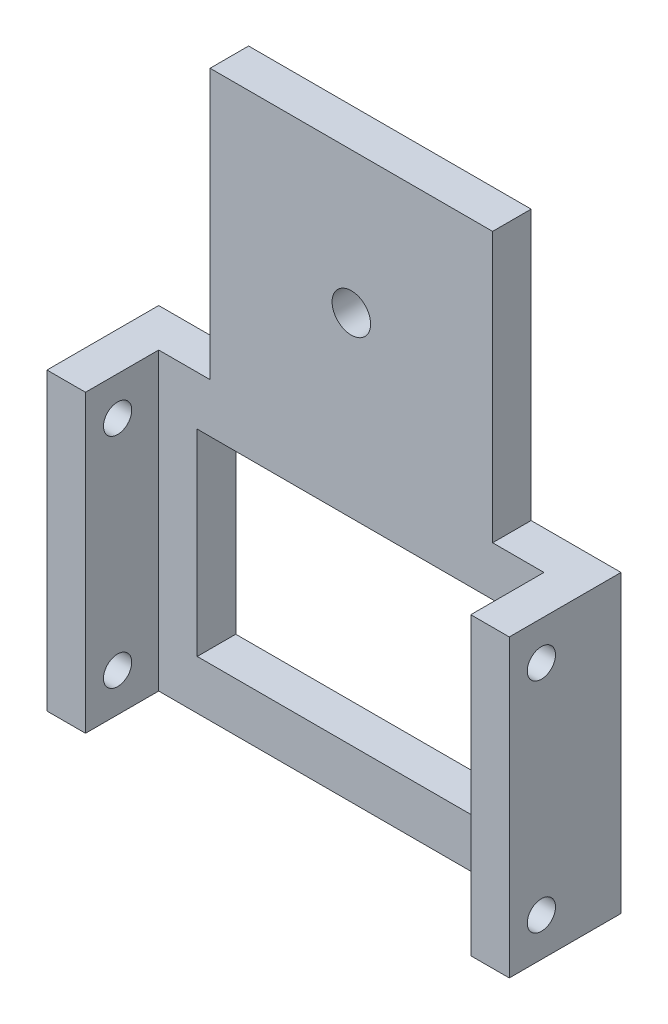
ISO-10303-21;
HEADER;
FILE_DESCRIPTION(('STEP AP214'),'2;1');
FILE_NAME('part.step','',(''),(''),'','','');
FILE_SCHEMA(('AUTOMOTIVE_DESIGN { 1 0 10303 214 1 1 1 1 }'));
ENDSEC;
DATA;
#1=APPLICATION_CONTEXT('core data for automotive mechanical design processes');
#2=APPLICATION_PROTOCOL_DEFINITION('international standard','automotive_design',2000,#1);
#3=PRODUCT_CONTEXT('',#1,'mechanical');
#4=PRODUCT('Part','Part','',(#3));
#5=PRODUCT_RELATED_PRODUCT_CATEGORY('part','',(#4));
#6=PRODUCT_DEFINITION_FORMATION('','',#4);
#7=PRODUCT_DEFINITION_CONTEXT('part definition',#1,'design');
#8=PRODUCT_DEFINITION('design','',#6,#7);
#9=PRODUCT_DEFINITION_SHAPE('','',#8);
#10=(LENGTH_UNIT() NAMED_UNIT(*) SI_UNIT(.MILLI.,.METRE.));
#11=(NAMED_UNIT(*) PLANE_ANGLE_UNIT() SI_UNIT($,.RADIAN.));
#12=(NAMED_UNIT(*) SI_UNIT($,.STERADIAN.) SOLID_ANGLE_UNIT());
#13=UNCERTAINTY_MEASURE_WITH_UNIT(LENGTH_MEASURE(1.E-05),#10,'distance_accuracy_value','');
#14=(GEOMETRIC_REPRESENTATION_CONTEXT(3) GLOBAL_UNCERTAINTY_ASSIGNED_CONTEXT((#13)) GLOBAL_UNIT_ASSIGNED_CONTEXT((#10,
#11,#12)) REPRESENTATION_CONTEXT('',''));
#15=CARTESIAN_POINT('',(0.,0.,0.));
#16=DIRECTION('',(0.,0.,1.));
#17=DIRECTION('',(1.,0.,0.));
#18=AXIS2_PLACEMENT_3D('',#15,#16,#17);
#19=CARTESIAN_POINT('',(0.,7.66666666666664,3.));
#20=DIRECTION('',(0.,1.,0.));
#21=DIRECTION('',(0.,0.,1.));
#22=AXIS2_PLACEMENT_3D('',#19,#20,#21);
#23=PLANE('',#22);
#24=DIRECTION('',(1.,0.,0.));
#25=VECTOR('',#24,1.);
#26=CARTESIAN_POINT('',(0.,7.66666666666664,0.));
#27=LINE('',#26,#25);
#28=CARTESIAN_POINT('',(-12.,7.66666666666664,0.));
#29=VERTEX_POINT('',#28);
#30=CARTESIAN_POINT('',(12.,7.66666666666664,0.));
#31=VERTEX_POINT('',#30);
#32=EDGE_CURVE('E181',#29,#31,#27,.T.);
#33=ORIENTED_EDGE('',*,*,#32,.T.);
#34=DIRECTION('',(0.,0.,-1.));
#35=VECTOR('',#34,1.);
#36=CARTESIAN_POINT('',(12.,7.66666666666664,3.));
#37=LINE('',#36,#35);
#38=CARTESIAN_POINT('',(12.,7.66666666666664,3.));
#39=VERTEX_POINT('',#38);
#40=EDGE_CURVE('E11',#39,#31,#37,.T.);
#41=ORIENTED_EDGE('',*,*,#40,.F.);
#42=DIRECTION('',(1.,0.,0.));
#43=VECTOR('',#42,1.);
#44=CARTESIAN_POINT('',(0.,7.66666666666664,3.));
#45=LINE('',#44,#43);
#46=CARTESIAN_POINT('',(-12.,7.66666666666664,3.));
#47=VERTEX_POINT('',#46);
#48=EDGE_CURVE('E131',#47,#39,#45,.T.);
#49=ORIENTED_EDGE('',*,*,#48,.F.);
#50=DIRECTION('',(0.,0.,-1.));
#51=VECTOR('',#50,1.);
#52=CARTESIAN_POINT('',(-12.,7.66666666666664,3.));
#53=LINE('',#52,#51);
#54=EDGE_CURVE('E61',#47,#29,#53,.T.);
#55=ORIENTED_EDGE('',*,*,#54,.T.);
#56=EDGE_LOOP('',(#33,#41,#49,#55));
#57=FACE_BOUND('',#56,.T.);
#58=ADVANCED_FACE('F41',(#57),#23,.F.);
#59=CARTESIAN_POINT('',(12.,0.,3.));
#60=DIRECTION('',(1.,0.,0.));
#61=DIRECTION('',(0.,0.,-1.));
#62=AXIS2_PLACEMENT_3D('',#59,#60,#61);
#63=PLANE('',#62);
#64=DIRECTION('',(0.,-1.,0.));
#65=VECTOR('',#64,1.);
#66=CARTESIAN_POINT('',(12.,0.,0.));
#67=LINE('',#66,#65);
#68=CARTESIAN_POINT('',(12.,-7.66666666666669,0.));
#69=VERTEX_POINT('',#68);
#70=EDGE_CURVE('E138',#31,#69,#67,.T.);
#71=ORIENTED_EDGE('',*,*,#70,.T.);
#72=DIRECTION('',(0.,0.,-1.));
#73=VECTOR('',#72,1.);
#74=CARTESIAN_POINT('',(12.,-7.66666666666669,3.));
#75=LINE('',#74,#73);
#76=CARTESIAN_POINT('',(12.,-7.66666666666669,3.));
#77=VERTEX_POINT('',#76);
#78=EDGE_CURVE('E52',#77,#69,#75,.T.);
#79=ORIENTED_EDGE('',*,*,#78,.F.);
#80=DIRECTION('',(0.,-1.,0.));
#81=VECTOR('',#80,1.);
#82=CARTESIAN_POINT('',(12.,0.,3.));
#83=LINE('',#82,#81);
#84=EDGE_CURVE('E125',#39,#77,#83,.T.);
#85=ORIENTED_EDGE('',*,*,#84,.F.);
#86=ORIENTED_EDGE('',*,*,#40,.T.);
#87=EDGE_LOOP('',(#71,#79,#85,#86));
#88=FACE_BOUND('',#87,.T.);
#89=ADVANCED_FACE('F137',(#88),#63,.F.);
#90=CARTESIAN_POINT('',(0.,-7.66666666666669,3.));
#91=DIRECTION('',(0.,1.,0.));
#92=DIRECTION('',(0.,0.,1.));
#93=AXIS2_PLACEMENT_3D('',#90,#91,#92);
#94=PLANE('',#93);
#95=DIRECTION('',(1.,0.,0.));
#96=VECTOR('',#95,1.);
#97=CARTESIAN_POINT('',(0.,-7.66666666666669,0.));
#98=LINE('',#97,#96);
#99=CARTESIAN_POINT('',(-12.,-7.66666666666669,0.));
#100=VERTEX_POINT('',#99);
#101=EDGE_CURVE('E186',#100,#69,#98,.T.);
#102=ORIENTED_EDGE('',*,*,#101,.F.);
#103=DIRECTION('',(0.,0.,-1.));
#104=VECTOR('',#103,1.);
#105=CARTESIAN_POINT('',(-12.,-7.66666666666669,3.));
#106=LINE('',#105,#104);
#107=CARTESIAN_POINT('',(-12.,-7.66666666666669,3.));
#108=VERTEX_POINT('',#107);
#109=EDGE_CURVE('E88',#108,#100,#106,.T.);
#110=ORIENTED_EDGE('',*,*,#109,.F.);
#111=DIRECTION('',(1.,0.,0.));
#112=VECTOR('',#111,1.);
#113=CARTESIAN_POINT('',(0.,-7.66666666666669,3.));
#114=LINE('',#113,#112);
#115=EDGE_CURVE('E130',#108,#77,#114,.T.);
#116=ORIENTED_EDGE('',*,*,#115,.T.);
#117=ORIENTED_EDGE('',*,*,#78,.T.);
#118=EDGE_LOOP('',(#102,#110,#116,#117));
#119=FACE_BOUND('',#118,.T.);
#120=ADVANCED_FACE('F143',(#119),#94,.T.);
#121=CARTESIAN_POINT('',(0.,11.5,3.));
#122=DIRECTION('',(0.,-1.,0.));
#123=DIRECTION('',(0.,0.,-1.));
#124=AXIS2_PLACEMENT_3D('',#121,#122,#123);
#125=PLANE('',#124);
#126=DIRECTION('',(-1.,0.,0.));
#127=VECTOR('',#126,1.);
#128=CARTESIAN_POINT('',(0.,11.5,0.));
#129=LINE('',#128,#127);
#130=CARTESIAN_POINT('',(18.,11.5,0.));
#131=VERTEX_POINT('',#130);
#132=CARTESIAN_POINT('',(11.,11.5,0.));
#133=VERTEX_POINT('',#132);
#134=EDGE_CURVE('E156',#131,#133,#129,.T.);
#135=ORIENTED_EDGE('',*,*,#134,.T.);
#136=DIRECTION('',(0.,0.,-1.));
#137=VECTOR('',#136,1.);
#138=CARTESIAN_POINT('',(11.,11.5,3.));
#139=LINE('',#138,#137);
#140=CARTESIAN_POINT('',(11.,11.5,3.));
#141=VERTEX_POINT('',#140);
#142=EDGE_CURVE('E45',#141,#133,#139,.T.);
#143=ORIENTED_EDGE('',*,*,#142,.F.);
#144=DIRECTION('',(-1.,0.,0.));
#145=VECTOR('',#144,1.);
#146=CARTESIAN_POINT('',(0.,11.5,3.));
#147=LINE('',#146,#145);
#148=CARTESIAN_POINT('',(15.,11.5,3.));
#149=VERTEX_POINT('',#148);
#150=EDGE_CURVE('E342',#149,#141,#147,.T.);
#151=ORIENTED_EDGE('',*,*,#150,.F.);
#152=DIRECTION('',(0.,0.,-1.));
#153=VECTOR('',#152,1.);
#154=CARTESIAN_POINT('',(15.,11.5,8.7));
#155=LINE('',#154,#153);
#156=CARTESIAN_POINT('',(15.,11.5,8.7));
#157=VERTEX_POINT('',#156);
#158=EDGE_CURVE('E157',#157,#149,#155,.T.);
#159=ORIENTED_EDGE('',*,*,#158,.F.);
#160=DIRECTION('',(-1.,0.,0.));
#161=VECTOR('',#160,1.);
#162=CARTESIAN_POINT('',(0.,11.5,8.7));
#163=LINE('',#162,#161);
#164=CARTESIAN_POINT('',(18.,11.5,8.7));
#165=VERTEX_POINT('',#164);
#166=EDGE_CURVE('E309',#165,#157,#163,.T.);
#167=ORIENTED_EDGE('',*,*,#166,.F.);
#168=DIRECTION('',(0.,0.,-1.));
#169=VECTOR('',#168,1.);
#170=CARTESIAN_POINT('',(18.,11.5,8.7));
#171=LINE('',#170,#169);
#172=EDGE_CURVE('E217',#165,#131,#171,.T.);
#173=ORIENTED_EDGE('',*,*,#172,.T.);
#174=EDGE_LOOP('',(#135,#143,#151,#159,#167,#173));
#175=FACE_BOUND('',#174,.T.);
#176=ADVANCED_FACE('F213',(#175),#125,.F.);
#177=CARTESIAN_POINT('',(11.,0.,3.));
#178=DIRECTION('',(-1.,0.,0.));
#179=DIRECTION('',(0.,0.,1.));
#180=AXIS2_PLACEMENT_3D('',#177,#178,#179);
#181=PLANE('',#180);
#182=DIRECTION('',(0.,1.,0.));
#183=VECTOR('',#182,1.);
#184=CARTESIAN_POINT('',(11.,0.,0.));
#185=LINE('',#184,#183);
#186=CARTESIAN_POINT('',(11.,32.5,0.));
#187=VERTEX_POINT('',#186);
#188=EDGE_CURVE('E161',#133,#187,#185,.T.);
#189=ORIENTED_EDGE('',*,*,#188,.T.);
#190=DIRECTION('',(0.,0.,-1.));
#191=VECTOR('',#190,1.);
#192=CARTESIAN_POINT('',(11.,32.5,3.));
#193=LINE('',#192,#191);
#194=CARTESIAN_POINT('',(11.,32.5,3.));
#195=VERTEX_POINT('',#194);
#196=EDGE_CURVE('E202',#195,#187,#193,.T.);
#197=ORIENTED_EDGE('',*,*,#196,.F.);
#198=DIRECTION('',(0.,1.,0.));
#199=VECTOR('',#198,1.);
#200=CARTESIAN_POINT('',(11.,0.,3.));
#201=LINE('',#200,#199);
#202=EDGE_CURVE('E101',#141,#195,#201,.T.);
#203=ORIENTED_EDGE('',*,*,#202,.F.);
#204=ORIENTED_EDGE('',*,*,#142,.T.);
#205=EDGE_LOOP('',(#189,#197,#203,#204));
#206=FACE_BOUND('',#205,.T.);
#207=ADVANCED_FACE('F209',(#206),#181,.F.);
#208=CARTESIAN_POINT('',(0.,32.5,3.));
#209=DIRECTION('',(0.,1.,0.));
#210=DIRECTION('',(0.,0.,1.));
#211=AXIS2_PLACEMENT_3D('',#208,#209,#210);
#212=PLANE('',#211);
#213=DIRECTION('',(1.,0.,0.));
#214=VECTOR('',#213,1.);
#215=CARTESIAN_POINT('',(0.,32.5,0.));
#216=LINE('',#215,#214);
#217=CARTESIAN_POINT('',(-11.,32.5,0.));
#218=VERTEX_POINT('',#217);
#219=EDGE_CURVE('E165',#218,#187,#216,.T.);
#220=ORIENTED_EDGE('',*,*,#219,.F.);
#221=DIRECTION('',(0.,0.,-1.));
#222=VECTOR('',#221,1.);
#223=CARTESIAN_POINT('',(-11.,32.5,3.));
#224=LINE('',#223,#222);
#225=CARTESIAN_POINT('',(-11.,32.5,3.));
#226=VERTEX_POINT('',#225);
#227=EDGE_CURVE('E200',#226,#218,#224,.T.);
#228=ORIENTED_EDGE('',*,*,#227,.F.);
#229=DIRECTION('',(1.,0.,0.));
#230=VECTOR('',#229,1.);
#231=CARTESIAN_POINT('',(0.,32.5,3.));
#232=LINE('',#231,#230);
#233=EDGE_CURVE('E347',#226,#195,#232,.T.);
#234=ORIENTED_EDGE('',*,*,#233,.T.);
#235=ORIENTED_EDGE('',*,*,#196,.T.);
#236=EDGE_LOOP('',(#220,#228,#234,#235));
#237=FACE_BOUND('',#236,.T.);
#238=ADVANCED_FACE('F384',(#237),#212,.T.);
#239=CARTESIAN_POINT('',(-11.,0.,3.));
#240=DIRECTION('',(-1.,0.,0.));
#241=DIRECTION('',(0.,0.,1.));
#242=AXIS2_PLACEMENT_3D('',#239,#240,#241);
#243=PLANE('',#242);
#244=DIRECTION('',(0.,1.,0.));
#245=VECTOR('',#244,1.);
#246=CARTESIAN_POINT('',(-11.,0.,0.));
#247=LINE('',#246,#245);
#248=CARTESIAN_POINT('',(-11.,11.5,0.));
#249=VERTEX_POINT('',#248);
#250=EDGE_CURVE('E169',#249,#218,#247,.T.);
#251=ORIENTED_EDGE('',*,*,#250,.F.);
#252=DIRECTION('',(0.,0.,-1.));
#253=VECTOR('',#252,1.);
#254=CARTESIAN_POINT('',(-11.,11.5,3.));
#255=LINE('',#254,#253);
#256=CARTESIAN_POINT('',(-11.,11.5,3.));
#257=VERTEX_POINT('',#256);
#258=EDGE_CURVE('E148',#257,#249,#255,.T.);
#259=ORIENTED_EDGE('',*,*,#258,.F.);
#260=DIRECTION('',(0.,1.,0.));
#261=VECTOR('',#260,1.);
#262=CARTESIAN_POINT('',(-11.,0.,3.));
#263=LINE('',#262,#261);
#264=EDGE_CURVE('E350',#257,#226,#263,.T.);
#265=ORIENTED_EDGE('',*,*,#264,.T.);
#266=ORIENTED_EDGE('',*,*,#227,.T.);
#267=EDGE_LOOP('',(#251,#259,#265,#266));
#268=FACE_BOUND('',#267,.T.);
#269=ADVANCED_FACE('F387',(#268),#243,.T.);
#270=CARTESIAN_POINT('',(0.,11.5,3.));
#271=DIRECTION('',(0.,-1.,0.));
#272=DIRECTION('',(0.,0.,-1.));
#273=AXIS2_PLACEMENT_3D('',#270,#271,#272);
#274=PLANE('',#273);
#275=DIRECTION('',(-1.,0.,0.));
#276=VECTOR('',#275,1.);
#277=CARTESIAN_POINT('',(0.,11.5,0.));
#278=LINE('',#277,#276);
#279=CARTESIAN_POINT('',(-18.,11.5,0.));
#280=VERTEX_POINT('',#279);
#281=EDGE_CURVE('E173',#249,#280,#278,.T.);
#282=ORIENTED_EDGE('',*,*,#281,.T.);
#283=DIRECTION('',(0.,0.,-1.));
#284=VECTOR('',#283,1.);
#285=CARTESIAN_POINT('',(-18.,11.5,8.7));
#286=LINE('',#285,#284);
#287=CARTESIAN_POINT('',(-18.,11.5,8.7));
#288=VERTEX_POINT('',#287);
#289=EDGE_CURVE('E272',#288,#280,#286,.T.);
#290=ORIENTED_EDGE('',*,*,#289,.F.);
#291=DIRECTION('',(-1.,0.,0.));
#292=VECTOR('',#291,1.);
#293=CARTESIAN_POINT('',(0.,11.5,8.7));
#294=LINE('',#293,#292);
#295=CARTESIAN_POINT('',(-15.,11.5,8.7));
#296=VERTEX_POINT('',#295);
#297=EDGE_CURVE('E275',#296,#288,#294,.T.);
#298=ORIENTED_EDGE('',*,*,#297,.F.);
#299=DIRECTION('',(0.,0.,-1.));
#300=VECTOR('',#299,1.);
#301=CARTESIAN_POINT('',(-15.,11.5,8.7));
#302=LINE('',#301,#300);
#303=CARTESIAN_POINT('',(-15.,11.5,3.));
#304=VERTEX_POINT('',#303);
#305=EDGE_CURVE('E260',#296,#304,#302,.T.);
#306=ORIENTED_EDGE('',*,*,#305,.T.);
#307=DIRECTION('',(-1.,0.,0.));
#308=VECTOR('',#307,1.);
#309=CARTESIAN_POINT('',(0.,11.5,3.));
#310=LINE('',#309,#308);
#311=EDGE_CURVE('E354',#257,#304,#310,.T.);
#312=ORIENTED_EDGE('',*,*,#311,.F.);
#313=ORIENTED_EDGE('',*,*,#258,.T.);
#314=EDGE_LOOP('',(#282,#290,#298,#306,#312,#313));
#315=FACE_BOUND('',#314,.T.);
#316=ADVANCED_FACE('F276',(#315),#274,.F.);
#317=CARTESIAN_POINT('',(0.,-11.5,3.));
#318=DIRECTION('',(0.,-1.,0.));
#319=DIRECTION('',(0.,0.,-1.));
#320=AXIS2_PLACEMENT_3D('',#317,#318,#319);
#321=PLANE('',#320);
#322=DIRECTION('',(-1.,0.,0.));
#323=VECTOR('',#322,1.);
#324=CARTESIAN_POINT('',(0.,-11.5,0.));
#325=LINE('',#324,#323);
#326=CARTESIAN_POINT('',(18.,-11.5,0.));
#327=VERTEX_POINT('',#326);
#328=CARTESIAN_POINT('',(-18.,-11.5,0.));
#329=VERTEX_POINT('',#328);
#330=EDGE_CURVE('E177',#327,#329,#325,.T.);
#331=ORIENTED_EDGE('',*,*,#330,.F.);
#332=DIRECTION('',(0.,0.,-1.));
#333=VECTOR('',#332,1.);
#334=CARTESIAN_POINT('',(18.,-11.5,8.7));
#335=LINE('',#334,#333);
#336=CARTESIAN_POINT('',(18.,-11.5,8.7));
#337=VERTEX_POINT('',#336);
#338=EDGE_CURVE('E328',#337,#327,#335,.T.);
#339=ORIENTED_EDGE('',*,*,#338,.F.);
#340=DIRECTION('',(-1.,0.,0.));
#341=VECTOR('',#340,1.);
#342=CARTESIAN_POINT('',(0.,-11.5,8.7));
#343=LINE('',#342,#341);
#344=CARTESIAN_POINT('',(15.,-11.5,8.7));
#345=VERTEX_POINT('',#344);
#346=EDGE_CURVE('E316',#337,#345,#343,.T.);
#347=ORIENTED_EDGE('',*,*,#346,.T.);
#348=DIRECTION('',(0.,0.,-1.));
#349=VECTOR('',#348,1.);
#350=CARTESIAN_POINT('',(15.,-11.5,8.7));
#351=LINE('',#350,#349);
#352=CARTESIAN_POINT('',(15.,-11.5,3.));
#353=VERTEX_POINT('',#352);
#354=EDGE_CURVE('E332',#345,#353,#351,.T.);
#355=ORIENTED_EDGE('',*,*,#354,.T.);
#356=DIRECTION('',(-1.,0.,0.));
#357=VECTOR('',#356,1.);
#358=CARTESIAN_POINT('',(0.,-11.5,3.));
#359=LINE('',#358,#357);
#360=CARTESIAN_POINT('',(-15.,-11.5,3.));
#361=VERTEX_POINT('',#360);
#362=EDGE_CURVE('E359',#353,#361,#359,.T.);
#363=ORIENTED_EDGE('',*,*,#362,.T.);
#364=DIRECTION('',(0.,0.,-1.));
#365=VECTOR('',#364,1.);
#366=CARTESIAN_POINT('',(-15.,-11.5,8.7));
#367=LINE('',#366,#365);
#368=CARTESIAN_POINT('',(-15.,-11.5,8.7));
#369=VERTEX_POINT('',#368);
#370=EDGE_CURVE('E299',#369,#361,#367,.T.);
#371=ORIENTED_EDGE('',*,*,#370,.F.);
#372=DIRECTION('',(-1.,0.,0.));
#373=VECTOR('',#372,1.);
#374=CARTESIAN_POINT('',(0.,-11.5,8.7));
#375=LINE('',#374,#373);
#376=CARTESIAN_POINT('',(-18.,-11.5,8.7));
#377=VERTEX_POINT('',#376);
#378=EDGE_CURVE('E285',#369,#377,#375,.T.);
#379=ORIENTED_EDGE('',*,*,#378,.T.);
#380=DIRECTION('',(0.,0.,-1.));
#381=VECTOR('',#380,1.);
#382=CARTESIAN_POINT('',(-18.,-11.5,8.7));
#383=LINE('',#382,#381);
#384=EDGE_CURVE('E303',#377,#329,#383,.T.);
#385=ORIENTED_EDGE('',*,*,#384,.T.);
#386=EDGE_LOOP('',(#331,#339,#347,#355,#363,#371,#379,#385));
#387=FACE_BOUND('',#386,.T.);
#388=ADVANCED_FACE('F375',(#387),#321,.T.);
#389=CARTESIAN_POINT('',(0.,21.5,3.));
#390=DIRECTION('',(0.,0.,-1.));
#391=DIRECTION('',(-1.,0.,0.));
#392=AXIS2_PLACEMENT_3D('',#389,#390,#391);
#393=CYLINDRICAL_SURFACE('',#392,1.5);
#394=CARTESIAN_POINT('',(0.,21.5,3.));
#395=DIRECTION('',(0.,0.,1.));
#396=DIRECTION('',(1.,0.,0.));
#397=AXIS2_PLACEMENT_3D('',#394,#395,#396);
#398=CIRCLE('',#397,1.5);
#399=CARTESIAN_POINT('',(1.5,21.5,3.));
#400=VERTEX_POINT('',#399);
#401=EDGE_CURVE('E193',#400,#400,#398,.T.);
#402=ORIENTED_EDGE('',*,*,#401,.T.);
#403=EDGE_LOOP('',(#402));
#404=FACE_BOUND('',#403,.T.);
#405=CARTESIAN_POINT('',(0.,21.5,0.));
#406=DIRECTION('',(0.,0.,1.));
#407=DIRECTION('',(1.,0.,0.));
#408=AXIS2_PLACEMENT_3D('',#405,#406,#407);
#409=CIRCLE('',#408,1.5);
#410=CARTESIAN_POINT('',(1.5,21.5,0.));
#411=VERTEX_POINT('',#410);
#412=EDGE_CURVE('E152',#411,#411,#409,.T.);
#413=ORIENTED_EDGE('',*,*,#412,.F.);
#414=EDGE_LOOP('',(#413));
#415=FACE_BOUND('',#414,.T.);
#416=ADVANCED_FACE('F43',(#404,#415),#393,.F.);
#417=CARTESIAN_POINT('',(-12.,0.,3.));
#418=DIRECTION('',(1.,0.,0.));
#419=DIRECTION('',(0.,0.,-1.));
#420=AXIS2_PLACEMENT_3D('',#417,#418,#419);
#421=PLANE('',#420);
#422=DIRECTION('',(0.,-1.,0.));
#423=VECTOR('',#422,1.);
#424=CARTESIAN_POINT('',(-12.,0.,0.));
#425=LINE('',#424,#423);
#426=EDGE_CURVE('E189',#29,#100,#425,.T.);
#427=ORIENTED_EDGE('',*,*,#426,.F.);
#428=ORIENTED_EDGE('',*,*,#54,.F.);
#429=DIRECTION('',(0.,-1.,0.));
#430=VECTOR('',#429,1.);
#431=CARTESIAN_POINT('',(-12.,0.,3.));
#432=LINE('',#431,#430);
#433=EDGE_CURVE('E145',#47,#108,#432,.T.);
#434=ORIENTED_EDGE('',*,*,#433,.T.);
#435=ORIENTED_EDGE('',*,*,#109,.T.);
#436=EDGE_LOOP('',(#427,#428,#434,#435));
#437=FACE_BOUND('',#436,.T.);
#438=ADVANCED_FACE('F430',(#437),#421,.T.);
#439=CARTESIAN_POINT('',(0.,0.,3.));
#440=DIRECTION('',(0.,0.,1.));
#441=DIRECTION('',(1.,0.,0.));
#442=AXIS2_PLACEMENT_3D('',#439,#440,#441);
#443=PLANE('',#442);
#444=ORIENTED_EDGE('',*,*,#401,.F.);
#445=EDGE_LOOP('',(#444));
#446=FACE_BOUND('',#445,.T.);
#447=ORIENTED_EDGE('',*,*,#150,.T.);
#448=ORIENTED_EDGE('',*,*,#202,.T.);
#449=ORIENTED_EDGE('',*,*,#233,.F.);
#450=ORIENTED_EDGE('',*,*,#264,.F.);
#451=ORIENTED_EDGE('',*,*,#311,.T.);
#452=DIRECTION('',(0.,-1.,0.));
#453=VECTOR('',#452,1.);
#454=CARTESIAN_POINT('',(-15.,0.,3.));
#455=LINE('',#454,#453);
#456=EDGE_CURVE('E267',#304,#361,#455,.T.);
#457=ORIENTED_EDGE('',*,*,#456,.T.);
#458=ORIENTED_EDGE('',*,*,#362,.F.);
#459=DIRECTION('',(0.,-1.,0.));
#460=VECTOR('',#459,1.);
#461=CARTESIAN_POINT('',(15.,0.,3.));
#462=LINE('',#461,#460);
#463=EDGE_CURVE('E363',#149,#353,#462,.T.);
#464=ORIENTED_EDGE('',*,*,#463,.F.);
#465=EDGE_LOOP('',(#447,#448,#449,#450,#451,#457,#458,#464));
#466=FACE_BOUND('',#465,.T.);
#467=ORIENTED_EDGE('',*,*,#48,.T.);
#468=ORIENTED_EDGE('',*,*,#84,.T.);
#469=ORIENTED_EDGE('',*,*,#115,.F.);
#470=ORIENTED_EDGE('',*,*,#433,.F.);
#471=EDGE_LOOP('',(#467,#468,#469,#470));
#472=FACE_BOUND('',#471,.T.);
#473=ADVANCED_FACE('F127',(#446,#466,#472),#443,.T.);
#474=CARTESIAN_POINT('',(0.,0.,0.));
#475=DIRECTION('',(0.,0.,1.));
#476=DIRECTION('',(1.,0.,0.));
#477=AXIS2_PLACEMENT_3D('',#474,#475,#476);
#478=PLANE('',#477);
#479=ORIENTED_EDGE('',*,*,#412,.T.);
#480=EDGE_LOOP('',(#479));
#481=FACE_BOUND('',#480,.T.);
#482=ORIENTED_EDGE('',*,*,#134,.F.);
#483=DIRECTION('',(0.,-1.,0.));
#484=VECTOR('',#483,1.);
#485=CARTESIAN_POINT('',(18.,0.,0.));
#486=LINE('',#485,#484);
#487=EDGE_CURVE('E224',#131,#327,#486,.T.);
#488=ORIENTED_EDGE('',*,*,#487,.T.);
#489=ORIENTED_EDGE('',*,*,#330,.T.);
#490=DIRECTION('',(0.,-1.,0.));
#491=VECTOR('',#490,1.);
#492=CARTESIAN_POINT('',(-18.,0.,0.));
#493=LINE('',#492,#491);
#494=EDGE_CURVE('E287',#280,#329,#493,.T.);
#495=ORIENTED_EDGE('',*,*,#494,.F.);
#496=ORIENTED_EDGE('',*,*,#281,.F.);
#497=ORIENTED_EDGE('',*,*,#250,.T.);
#498=ORIENTED_EDGE('',*,*,#219,.T.);
#499=ORIENTED_EDGE('',*,*,#188,.F.);
#500=EDGE_LOOP('',(#482,#488,#489,#495,#496,#497,#498,#499));
#501=FACE_BOUND('',#500,.T.);
#502=ORIENTED_EDGE('',*,*,#32,.F.);
#503=ORIENTED_EDGE('',*,*,#426,.T.);
#504=ORIENTED_EDGE('',*,*,#101,.T.);
#505=ORIENTED_EDGE('',*,*,#70,.F.);
#506=EDGE_LOOP('',(#502,#503,#504,#505));
#507=FACE_BOUND('',#506,.T.);
#508=ADVANCED_FACE('F221',(#481,#501,#507),#478,.F.);
#509=CARTESIAN_POINT('',(15.,0.,8.7));
#510=DIRECTION('',(1.,0.,0.));
#511=DIRECTION('',(0.,1.,0.));
#512=AXIS2_PLACEMENT_3D('',#509,#510,#511);
#513=PLANE('',#512);
#514=CARTESIAN_POINT('',(15.,8.49999999999998,6.2));
#515=DIRECTION('',(1.,0.,0.));
#516=DIRECTION('',(0.,1.,0.));
#517=AXIS2_PLACEMENT_3D('',#514,#515,#516);
#518=CIRCLE('',#517,1.1);
#519=CARTESIAN_POINT('',(15.,9.59999999999998,6.2));
#520=VERTEX_POINT('',#519);
#521=EDGE_CURVE('E291',#520,#520,#518,.T.);
#522=ORIENTED_EDGE('',*,*,#521,.T.);
#523=EDGE_LOOP('',(#522));
#524=FACE_BOUND('',#523,.T.);
#525=CARTESIAN_POINT('',(15.,-8.50000000000002,6.2));
#526=DIRECTION('',(1.,0.,0.));
#527=DIRECTION('',(0.,1.,0.));
#528=AXIS2_PLACEMENT_3D('',#525,#526,#527);
#529=CIRCLE('',#528,1.1);
#530=CARTESIAN_POINT('',(15.,-7.40000000000002,6.2));
#531=VERTEX_POINT('',#530);
#532=EDGE_CURVE('E516',#531,#531,#529,.T.);
#533=ORIENTED_EDGE('',*,*,#532,.T.);
#534=EDGE_LOOP('',(#533));
#535=FACE_BOUND('',#534,.T.);
#536=ORIENTED_EDGE('',*,*,#158,.T.);
#537=ORIENTED_EDGE('',*,*,#463,.T.);
#538=ORIENTED_EDGE('',*,*,#354,.F.);
#539=DIRECTION('',(0.,-1.,0.));
#540=VECTOR('',#539,1.);
#541=CARTESIAN_POINT('',(15.,0.,8.7));
#542=LINE('',#541,#540);
#543=EDGE_CURVE('E313',#157,#345,#542,.T.);
#544=ORIENTED_EDGE('',*,*,#543,.F.);
#545=EDGE_LOOP('',(#536,#537,#538,#544));
#546=FACE_BOUND('',#545,.T.);
#547=ADVANCED_FACE('F370',(#524,#535,#546),#513,.F.);
#548=CARTESIAN_POINT('',(18.,0.,8.7));
#549=DIRECTION('',(1.,0.,0.));
#550=DIRECTION('',(0.,1.,0.));
#551=AXIS2_PLACEMENT_3D('',#548,#549,#550);
#552=PLANE('',#551);
#553=CARTESIAN_POINT('',(18.,8.49999999999998,6.2));
#554=DIRECTION('',(1.,0.,0.));
#555=DIRECTION('',(0.,0.,-1.));
#556=AXIS2_PLACEMENT_3D('',#553,#554,#555);
#557=CIRCLE('',#556,1.1);
#558=CARTESIAN_POINT('',(18.,8.49999999999998,5.1));
#559=VERTEX_POINT('',#558);
#560=EDGE_CURVE('E509',#559,#559,#557,.T.);
#561=ORIENTED_EDGE('',*,*,#560,.F.);
#562=EDGE_LOOP('',(#561));
#563=FACE_BOUND('',#562,.T.);
#564=CARTESIAN_POINT('',(18.,-8.50000000000002,6.2));
#565=DIRECTION('',(1.,0.,0.));
#566=DIRECTION('',(0.,0.,-1.));
#567=AXIS2_PLACEMENT_3D('',#564,#565,#566);
#568=CIRCLE('',#567,1.1);
#569=CARTESIAN_POINT('',(18.,-8.50000000000002,5.1));
#570=VERTEX_POINT('',#569);
#571=EDGE_CURVE('E531',#570,#570,#568,.T.);
#572=ORIENTED_EDGE('',*,*,#571,.F.);
#573=EDGE_LOOP('',(#572));
#574=FACE_BOUND('',#573,.T.);
#575=ORIENTED_EDGE('',*,*,#487,.F.);
#576=ORIENTED_EDGE('',*,*,#172,.F.);
#577=DIRECTION('',(0.,-1.,0.));
#578=VECTOR('',#577,1.);
#579=CARTESIAN_POINT('',(18.,0.,8.7));
#580=LINE('',#579,#578);
#581=EDGE_CURVE('E320',#165,#337,#580,.T.);
#582=ORIENTED_EDGE('',*,*,#581,.T.);
#583=ORIENTED_EDGE('',*,*,#338,.T.);
#584=EDGE_LOOP('',(#575,#576,#582,#583));
#585=FACE_BOUND('',#584,.T.);
#586=ADVANCED_FACE('F381',(#563,#574,#585),#552,.T.);
#587=CARTESIAN_POINT('',(0.,0.,8.7));
#588=DIRECTION('',(0.,0.,1.));
#589=DIRECTION('',(1.,0.,0.));
#590=AXIS2_PLACEMENT_3D('',#587,#588,#589);
#591=PLANE('',#590);
#592=ORIENTED_EDGE('',*,*,#166,.T.);
#593=ORIENTED_EDGE('',*,*,#543,.T.);
#594=ORIENTED_EDGE('',*,*,#346,.F.);
#595=ORIENTED_EDGE('',*,*,#581,.F.);
#596=EDGE_LOOP('',(#592,#593,#594,#595));
#597=FACE_BOUND('',#596,.T.);
#598=ADVANCED_FACE('F379',(#597),#591,.T.);
#599=CARTESIAN_POINT('',(-15.,0.,8.7));
#600=DIRECTION('',(1.,0.,0.));
#601=DIRECTION('',(0.,1.,0.));
#602=AXIS2_PLACEMENT_3D('',#599,#600,#601);
#603=PLANE('',#602);
#604=CARTESIAN_POINT('',(-15.,8.49999999999998,6.2));
#605=DIRECTION('',(1.,0.,0.));
#606=DIRECTION('',(0.,1.,0.));
#607=AXIS2_PLACEMENT_3D('',#604,#605,#606);
#608=CIRCLE('',#607,1.1);
#609=CARTESIAN_POINT('',(-15.,9.59999999999998,6.2));
#610=VERTEX_POINT('',#609);
#611=EDGE_CURVE('E513',#610,#610,#608,.T.);
#612=ORIENTED_EDGE('',*,*,#611,.F.);
#613=EDGE_LOOP('',(#612));
#614=FACE_BOUND('',#613,.T.);
#615=CARTESIAN_POINT('',(-15.,-8.50000000000002,6.2));
#616=DIRECTION('',(1.,0.,0.));
#617=DIRECTION('',(0.,1.,0.));
#618=AXIS2_PLACEMENT_3D('',#615,#616,#617);
#619=CIRCLE('',#618,1.1);
#620=CARTESIAN_POINT('',(-15.,-7.40000000000002,6.2));
#621=VERTEX_POINT('',#620);
#622=EDGE_CURVE('E520',#621,#621,#619,.T.);
#623=ORIENTED_EDGE('',*,*,#622,.F.);
#624=EDGE_LOOP('',(#623));
#625=FACE_BOUND('',#624,.T.);
#626=ORIENTED_EDGE('',*,*,#456,.F.);
#627=ORIENTED_EDGE('',*,*,#305,.F.);
#628=DIRECTION('',(0.,-1.,0.));
#629=VECTOR('',#628,1.);
#630=CARTESIAN_POINT('',(-15.,0.,8.7));
#631=LINE('',#630,#629);
#632=EDGE_CURVE('E264',#296,#369,#631,.T.);
#633=ORIENTED_EDGE('',*,*,#632,.T.);
#634=ORIENTED_EDGE('',*,*,#370,.T.);
#635=EDGE_LOOP('',(#626,#627,#633,#634));
#636=FACE_BOUND('',#635,.T.);
#637=ADVANCED_FACE('F262',(#614,#625,#636),#603,.T.);
#638=CARTESIAN_POINT('',(-18.,0.,8.7));
#639=DIRECTION('',(1.,0.,0.));
#640=DIRECTION('',(0.,1.,0.));
#641=AXIS2_PLACEMENT_3D('',#638,#639,#640);
#642=PLANE('',#641);
#643=CARTESIAN_POINT('',(-18.,8.49999999999998,6.2));
#644=DIRECTION('',(1.,0.,0.));
#645=DIRECTION('',(0.,1.,0.));
#646=AXIS2_PLACEMENT_3D('',#643,#644,#645);
#647=CIRCLE('',#646,1.1);
#648=CARTESIAN_POINT('',(-18.,9.59999999999998,6.2));
#649=VERTEX_POINT('',#648);
#650=EDGE_CURVE('E526',#649,#649,#647,.F.);
#651=ORIENTED_EDGE('',*,*,#650,.F.);
#652=EDGE_LOOP('',(#651));
#653=FACE_BOUND('',#652,.T.);
#654=CARTESIAN_POINT('',(-18.,-8.50000000000002,6.2));
#655=DIRECTION('',(1.,0.,0.));
#656=DIRECTION('',(0.,1.,0.));
#657=AXIS2_PLACEMENT_3D('',#654,#655,#656);
#658=CIRCLE('',#657,1.1);
#659=CARTESIAN_POINT('',(-18.,-7.40000000000002,6.2));
#660=VERTEX_POINT('',#659);
#661=EDGE_CURVE('E527',#660,#660,#658,.F.);
#662=ORIENTED_EDGE('',*,*,#661,.F.);
#663=EDGE_LOOP('',(#662));
#664=FACE_BOUND('',#663,.T.);
#665=ORIENTED_EDGE('',*,*,#494,.T.);
#666=ORIENTED_EDGE('',*,*,#384,.F.);
#667=DIRECTION('',(0.,-1.,0.));
#668=VECTOR('',#667,1.);
#669=CARTESIAN_POINT('',(-18.,0.,8.7));
#670=LINE('',#669,#668);
#671=EDGE_CURVE('E281',#288,#377,#670,.T.);
#672=ORIENTED_EDGE('',*,*,#671,.F.);
#673=ORIENTED_EDGE('',*,*,#289,.T.);
#674=EDGE_LOOP('',(#665,#666,#672,#673));
#675=FACE_BOUND('',#674,.T.);
#676=ADVANCED_FACE('F392',(#653,#664,#675),#642,.F.);
#677=CARTESIAN_POINT('',(0.,0.,8.7));
#678=DIRECTION('',(0.,0.,1.));
#679=DIRECTION('',(1.,0.,0.));
#680=AXIS2_PLACEMENT_3D('',#677,#678,#679);
#681=PLANE('',#680);
#682=ORIENTED_EDGE('',*,*,#632,.F.);
#683=ORIENTED_EDGE('',*,*,#297,.T.);
#684=ORIENTED_EDGE('',*,*,#671,.T.);
#685=ORIENTED_EDGE('',*,*,#378,.F.);
#686=EDGE_LOOP('',(#682,#683,#684,#685));
#687=FACE_BOUND('',#686,.T.);
#688=ADVANCED_FACE('F283',(#687),#681,.T.);
#689=CARTESIAN_POINT('',(-21.1112698372208,-8.50000000000002,6.2));
#690=DIRECTION('',(1.,0.,0.));
#691=DIRECTION('',(0.,0.,-1.));
#692=AXIS2_PLACEMENT_3D('',#689,#690,#691);
#693=CYLINDRICAL_SURFACE('',#692,1.1);
#694=ORIENTED_EDGE('',*,*,#622,.T.);
#695=EDGE_LOOP('',(#694));
#696=FACE_BOUND('',#695,.T.);
#697=ORIENTED_EDGE('',*,*,#661,.T.);
#698=EDGE_LOOP('',(#697));
#699=FACE_BOUND('',#698,.T.);
#700=ADVANCED_FACE('F400',(#696,#699),#693,.F.);
#701=CARTESIAN_POINT('',(-21.1112698372208,8.49999999999998,6.2));
#702=DIRECTION('',(1.,0.,0.));
#703=DIRECTION('',(0.,0.,-1.));
#704=AXIS2_PLACEMENT_3D('',#701,#702,#703);
#705=CYLINDRICAL_SURFACE('',#704,1.1);
#706=ORIENTED_EDGE('',*,*,#611,.T.);
#707=EDGE_LOOP('',(#706));
#708=FACE_BOUND('',#707,.T.);
#709=ORIENTED_EDGE('',*,*,#650,.T.);
#710=EDGE_LOOP('',(#709));
#711=FACE_BOUND('',#710,.T.);
#712=ADVANCED_FACE('F474',(#708,#711),#705,.F.);
#713=ORIENTED_EDGE('',*,*,#571,.T.);
#714=EDGE_LOOP('',(#713));
#715=FACE_BOUND('',#714,.T.);
#716=ORIENTED_EDGE('',*,*,#532,.F.);
#717=EDGE_LOOP('',(#716));
#718=FACE_BOUND('',#717,.T.);
#719=ADVANCED_FACE('F477',(#715,#718),#693,.F.);
#720=ORIENTED_EDGE('',*,*,#560,.T.);
#721=EDGE_LOOP('',(#720));
#722=FACE_BOUND('',#721,.T.);
#723=ORIENTED_EDGE('',*,*,#521,.F.);
#724=EDGE_LOOP('',(#723));
#725=FACE_BOUND('',#724,.T.);
#726=ADVANCED_FACE('F487',(#722,#725),#705,.F.);
#727=CLOSED_SHELL('',(#58,#89,#120,#176,#207,#238,#269,#316,#388,#416,#438,#473,#508,#547,#586,
#598,#637,#676,#688,#700,#712,#719,#726));
#728=MANIFOLD_SOLID_BREP('B2',#727);
#729=ADVANCED_BREP_SHAPE_REPRESENTATION('',(#18,#728),#14);
#730=SHAPE_DEFINITION_REPRESENTATION(#9,#729);
ENDSEC;
END-ISO-10303-21;
